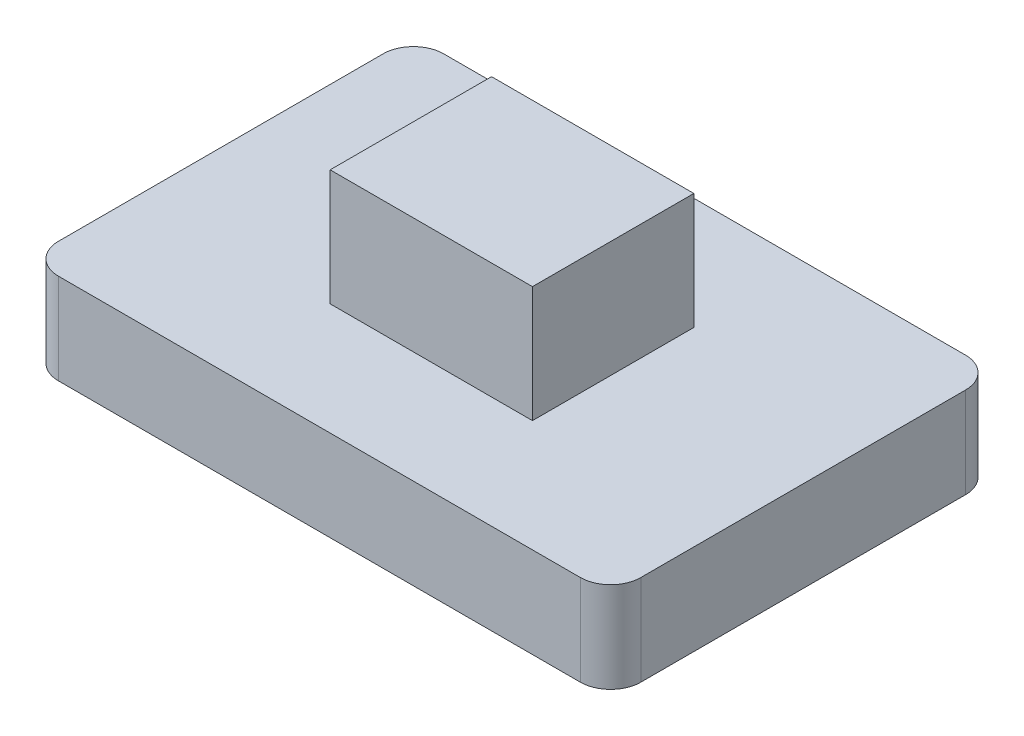
ISO-10303-21;
HEADER;
FILE_DESCRIPTION(('STEP AP214'),'2;1');
FILE_NAME('part.step','',(''),(''),'','','');
FILE_SCHEMA(('AUTOMOTIVE_DESIGN { 1 0 10303 214 1 1 1 1 }'));
ENDSEC;
DATA;
#1=APPLICATION_CONTEXT('core data for automotive mechanical design processes');
#2=APPLICATION_PROTOCOL_DEFINITION('international standard','automotive_design',2000,#1);
#3=PRODUCT_CONTEXT('',#1,'mechanical');
#4=PRODUCT('Part','Part','',(#3));
#5=PRODUCT_RELATED_PRODUCT_CATEGORY('part','',(#4));
#6=PRODUCT_DEFINITION_FORMATION('','',#4);
#7=PRODUCT_DEFINITION_CONTEXT('part definition',#1,'design');
#8=PRODUCT_DEFINITION('design','',#6,#7);
#9=PRODUCT_DEFINITION_SHAPE('','',#8);
#10=(LENGTH_UNIT() NAMED_UNIT(*) SI_UNIT(.MILLI.,.METRE.));
#11=(NAMED_UNIT(*) PLANE_ANGLE_UNIT() SI_UNIT($,.RADIAN.));
#12=(NAMED_UNIT(*) SI_UNIT($,.STERADIAN.) SOLID_ANGLE_UNIT());
#13=UNCERTAINTY_MEASURE_WITH_UNIT(LENGTH_MEASURE(1.E-05),#10,'distance_accuracy_value','');
#14=(GEOMETRIC_REPRESENTATION_CONTEXT(3) GLOBAL_UNCERTAINTY_ASSIGNED_CONTEXT((#13)) GLOBAL_UNIT_ASSIGNED_CONTEXT((#10,
#11,#12)) REPRESENTATION_CONTEXT('',''));
#15=CARTESIAN_POINT('',(0.,0.,0.));
#16=DIRECTION('',(0.,0.,1.));
#17=DIRECTION('',(1.,0.,0.));
#18=AXIS2_PLACEMENT_3D('',#15,#16,#17);
#19=CARTESIAN_POINT('',(6.35,0.,-6.35));
#20=DIRECTION('',(0.,-1.,0.));
#21=DIRECTION('',(0.,0.,-1.));
#22=AXIS2_PLACEMENT_3D('',#19,#20,#21);
#23=PLANE('',#22);
#24=CARTESIAN_POINT('',(6.35,0.,-6.35));
#25=DIRECTION('',(0.,1.,0.));
#26=DIRECTION('',(0.,0.,-1.));
#27=AXIS2_PLACEMENT_3D('',#24,#25,#26);
#28=CIRCLE('',#27,6.35);
#29=CARTESIAN_POINT('',(0.,0.,-6.35000000000004));
#30=VERTEX_POINT('',#29);
#31=CARTESIAN_POINT('',(6.35000000000004,0.,0.));
#32=VERTEX_POINT('',#31);
#33=EDGE_CURVE('E142',#30,#32,#28,.T.);
#34=ORIENTED_EDGE('',*,*,#33,.T.);
#35=DIRECTION('',(1.,0.,0.));
#36=VECTOR('',#35,1.);
#37=CARTESIAN_POINT('',(6.35000000000004,0.,0.));
#38=LINE('',#37,#36);
#39=CARTESIAN_POINT('',(116.00392100101,0.,0.));
#40=VERTEX_POINT('',#39);
#41=EDGE_CURVE('E145',#32,#40,#38,.T.);
#42=ORIENTED_EDGE('',*,*,#41,.T.);
#43=CARTESIAN_POINT('',(116.00392100101,0.,-6.35));
#44=DIRECTION('',(0.,1.,0.));
#45=DIRECTION('',(0.,0.,-1.));
#46=AXIS2_PLACEMENT_3D('',#43,#44,#45);
#47=CIRCLE('',#46,6.35);
#48=CARTESIAN_POINT('',(122.35392100101,0.,-6.35000000000004));
#49=VERTEX_POINT('',#48);
#50=EDGE_CURVE('E178',#40,#49,#47,.T.);
#51=ORIENTED_EDGE('',*,*,#50,.T.);
#52=DIRECTION('',(0.,0.,-1.));
#53=VECTOR('',#52,1.);
#54=CARTESIAN_POINT('',(122.35392100101,0.,-6.35000000000004));
#55=LINE('',#54,#53);
#56=CARTESIAN_POINT('',(122.35392100101,0.,-74.5792583117359));
#57=VERTEX_POINT('',#56);
#58=EDGE_CURVE('E181',#49,#57,#55,.T.);
#59=ORIENTED_EDGE('',*,*,#58,.T.);
#60=CARTESIAN_POINT('',(116.00392100101,0.,-74.579258311736));
#61=DIRECTION('',(0.,1.,0.));
#62=DIRECTION('',(0.,0.,1.));
#63=AXIS2_PLACEMENT_3D('',#60,#61,#62);
#64=CIRCLE('',#63,6.34999999999999);
#65=CARTESIAN_POINT('',(116.00392100101,0.,-80.9292583117359));
#66=VERTEX_POINT('',#65);
#67=EDGE_CURVE('E184',#57,#66,#64,.T.);
#68=ORIENTED_EDGE('',*,*,#67,.T.);
#69=DIRECTION('',(-1.,0.,0.));
#70=VECTOR('',#69,1.);
#71=CARTESIAN_POINT('',(6.35000000000004,0.,-80.9292583117359));
#72=LINE('',#71,#70);
#73=CARTESIAN_POINT('',(6.35000000000004,0.,-80.9292583117359));
#74=VERTEX_POINT('',#73);
#75=EDGE_CURVE('E187',#66,#74,#72,.T.);
#76=ORIENTED_EDGE('',*,*,#75,.T.);
#77=CARTESIAN_POINT('',(6.35,0.,-74.579258311736));
#78=DIRECTION('',(0.,1.,0.));
#79=DIRECTION('',(0.,0.,1.));
#80=AXIS2_PLACEMENT_3D('',#77,#78,#79);
#81=CIRCLE('',#80,6.35);
#82=CARTESIAN_POINT('',(0.,0.,-74.5792583117359));
#83=VERTEX_POINT('',#82);
#84=EDGE_CURVE('E190',#74,#83,#81,.T.);
#85=ORIENTED_EDGE('',*,*,#84,.T.);
#86=DIRECTION('',(0.,0.,1.));
#87=VECTOR('',#86,1.);
#88=CARTESIAN_POINT('',(0.,0.,-6.35000000000004));
#89=LINE('',#88,#87);
#90=EDGE_CURVE('E155',#83,#30,#89,.T.);
#91=ORIENTED_EDGE('',*,*,#90,.T.);
#92=EDGE_LOOP('',(#34,#42,#51,#59,#68,#76,#85,#91));
#93=FACE_BOUND('',#92,.T.);
#94=DIRECTION('',(0.,0.,-1.));
#95=VECTOR('',#94,1.);
#96=CARTESIAN_POINT('',(82.4295273333746,0.,-57.4189167731253));
#97=LINE('',#96,#95);
#98=CARTESIAN_POINT('',(82.4295273333746,0.,-23.5103415386106));
#99=VERTEX_POINT('',#98);
#100=CARTESIAN_POINT('',(82.4295273333746,0.,-57.4189167731253));
#101=VERTEX_POINT('',#100);
#102=EDGE_CURVE('E141',#99,#101,#97,.T.);
#103=ORIENTED_EDGE('',*,*,#102,.F.);
#104=DIRECTION('',(1.,0.,0.));
#105=VECTOR('',#104,1.);
#106=CARTESIAN_POINT('',(39.9243936676357,0.,-23.5103415386106));
#107=LINE('',#106,#105);
#108=CARTESIAN_POINT('',(39.9243936676357,0.,-23.5103415386106));
#109=VERTEX_POINT('',#108);
#110=EDGE_CURVE('E138',#109,#99,#107,.T.);
#111=ORIENTED_EDGE('',*,*,#110,.F.);
#112=DIRECTION('',(0.,0.,1.));
#113=VECTOR('',#112,1.);
#114=CARTESIAN_POINT('',(39.9243936676357,0.,-57.4189167731253));
#115=LINE('',#114,#113);
#116=CARTESIAN_POINT('',(39.9243936676357,0.,-57.4189167731253));
#117=VERTEX_POINT('',#116);
#118=EDGE_CURVE('E53',#117,#109,#115,.T.);
#119=ORIENTED_EDGE('',*,*,#118,.F.);
#120=DIRECTION('',(-1.,0.,0.));
#121=VECTOR('',#120,1.);
#122=CARTESIAN_POINT('',(39.9243936676357,0.,-57.4189167731253));
#123=LINE('',#122,#121);
#124=EDGE_CURVE('E48',#101,#117,#123,.T.);
#125=ORIENTED_EDGE('',*,*,#124,.F.);
#126=EDGE_LOOP('',(#103,#111,#119,#125));
#127=FACE_BOUND('',#126,.T.);
#128=ADVANCED_FACE('F31',(#93,#127),#23,.F.);
#129=CARTESIAN_POINT('',(6.35,-19.05,-6.35));
#130=DIRECTION('',(0.,1.,0.));
#131=DIRECTION('',(0.,0.,1.));
#132=AXIS2_PLACEMENT_3D('',#129,#130,#131);
#133=CYLINDRICAL_SURFACE('',#132,6.35);
#134=ORIENTED_EDGE('',*,*,#33,.F.);
#135=DIRECTION('',(0.,1.,0.));
#136=VECTOR('',#135,1.);
#137=CARTESIAN_POINT('',(0.,-19.05,-6.35000000000004));
#138=LINE('',#137,#136);
#139=CARTESIAN_POINT('',(0.,-19.05,-6.35000000000004));
#140=VERTEX_POINT('',#139);
#141=EDGE_CURVE('E11',#140,#30,#138,.T.);
#142=ORIENTED_EDGE('',*,*,#141,.F.);
#143=CARTESIAN_POINT('',(6.35,-19.05,-6.35));
#144=DIRECTION('',(0.,1.,0.));
#145=DIRECTION('',(0.,0.,-1.));
#146=AXIS2_PLACEMENT_3D('',#143,#144,#145);
#147=CIRCLE('',#146,6.35);
#148=CARTESIAN_POINT('',(6.35000000000004,-19.05,0.));
#149=VERTEX_POINT('',#148);
#150=EDGE_CURVE('E151',#140,#149,#147,.T.);
#151=ORIENTED_EDGE('',*,*,#150,.T.);
#152=DIRECTION('',(0.,1.,0.));
#153=VECTOR('',#152,1.);
#154=CARTESIAN_POINT('',(6.35000000000004,-19.05,0.));
#155=LINE('',#154,#153);
#156=EDGE_CURVE('E35',#149,#32,#155,.T.);
#157=ORIENTED_EDGE('',*,*,#156,.T.);
#158=EDGE_LOOP('',(#134,#142,#151,#157));
#159=FACE_BOUND('',#158,.T.);
#160=ADVANCED_FACE('F33',(#159),#133,.T.);
#161=CARTESIAN_POINT('',(0.,-19.05,-6.35000000000004));
#162=DIRECTION('',(-1.,0.,0.));
#163=DIRECTION('',(0.,0.,1.));
#164=AXIS2_PLACEMENT_3D('',#161,#162,#163);
#165=PLANE('',#164);
#166=ORIENTED_EDGE('',*,*,#90,.F.);
#167=DIRECTION('',(0.,1.,0.));
#168=VECTOR('',#167,1.);
#169=CARTESIAN_POINT('',(0.,-19.05,-74.5792583117359));
#170=LINE('',#169,#168);
#171=CARTESIAN_POINT('',(0.,-19.05,-74.5792583117359));
#172=VERTEX_POINT('',#171);
#173=EDGE_CURVE('E40',#172,#83,#170,.T.);
#174=ORIENTED_EDGE('',*,*,#173,.F.);
#175=DIRECTION('',(0.,0.,1.));
#176=VECTOR('',#175,1.);
#177=CARTESIAN_POINT('',(0.,-19.05,-6.35000000000004));
#178=LINE('',#177,#176);
#179=EDGE_CURVE('E173',#172,#140,#178,.T.);
#180=ORIENTED_EDGE('',*,*,#179,.T.);
#181=ORIENTED_EDGE('',*,*,#141,.T.);
#182=EDGE_LOOP('',(#166,#174,#180,#181));
#183=FACE_BOUND('',#182,.T.);
#184=ADVANCED_FACE('F216',(#183),#165,.T.);
#185=CARTESIAN_POINT('',(6.35,-19.05,-74.579258311736));
#186=DIRECTION('',(0.,1.,0.));
#187=DIRECTION('',(0.,0.,1.));
#188=AXIS2_PLACEMENT_3D('',#185,#186,#187);
#189=CYLINDRICAL_SURFACE('',#188,6.35);
#190=ORIENTED_EDGE('',*,*,#84,.F.);
#191=DIRECTION('',(0.,1.,0.));
#192=VECTOR('',#191,1.);
#193=CARTESIAN_POINT('',(6.35000000000004,-19.05,-80.9292583117359));
#194=LINE('',#193,#192);
#195=CARTESIAN_POINT('',(6.35000000000004,-19.05,-80.9292583117359));
#196=VERTEX_POINT('',#195);
#197=EDGE_CURVE('E196',#196,#74,#194,.T.);
#198=ORIENTED_EDGE('',*,*,#197,.F.);
#199=CARTESIAN_POINT('',(6.35,-19.05,-74.579258311736));
#200=DIRECTION('',(0.,1.,0.));
#201=DIRECTION('',(0.,0.,1.));
#202=AXIS2_PLACEMENT_3D('',#199,#200,#201);
#203=CIRCLE('',#202,6.35);
#204=EDGE_CURVE('E170',#196,#172,#203,.T.);
#205=ORIENTED_EDGE('',*,*,#204,.T.);
#206=ORIENTED_EDGE('',*,*,#173,.T.);
#207=EDGE_LOOP('',(#190,#198,#205,#206));
#208=FACE_BOUND('',#207,.T.);
#209=ADVANCED_FACE('F237',(#208),#189,.T.);
#210=CARTESIAN_POINT('',(6.35000000000004,-19.05,-80.9292583117359));
#211=DIRECTION('',(0.,0.,-1.));
#212=DIRECTION('',(-1.,0.,0.));
#213=AXIS2_PLACEMENT_3D('',#210,#211,#212);
#214=PLANE('',#213);
#215=ORIENTED_EDGE('',*,*,#75,.F.);
#216=DIRECTION('',(0.,1.,0.));
#217=VECTOR('',#216,1.);
#218=CARTESIAN_POINT('',(116.00392100101,-19.05,-80.9292583117359));
#219=LINE('',#218,#217);
#220=CARTESIAN_POINT('',(116.00392100101,-19.05,-80.9292583117359));
#221=VERTEX_POINT('',#220);
#222=EDGE_CURVE('E198',#221,#66,#219,.T.);
#223=ORIENTED_EDGE('',*,*,#222,.F.);
#224=DIRECTION('',(-1.,0.,0.));
#225=VECTOR('',#224,1.);
#226=CARTESIAN_POINT('',(6.35000000000004,-19.05,-80.9292583117359));
#227=LINE('',#226,#225);
#228=EDGE_CURVE('E167',#221,#196,#227,.T.);
#229=ORIENTED_EDGE('',*,*,#228,.T.);
#230=ORIENTED_EDGE('',*,*,#197,.T.);
#231=EDGE_LOOP('',(#215,#223,#229,#230));
#232=FACE_BOUND('',#231,.T.);
#233=ADVANCED_FACE('F235',(#232),#214,.T.);
#234=CARTESIAN_POINT('',(116.00392100101,-19.05,-74.579258311736));
#235=DIRECTION('',(0.,1.,0.));
#236=DIRECTION('',(0.,0.,1.));
#237=AXIS2_PLACEMENT_3D('',#234,#235,#236);
#238=CYLINDRICAL_SURFACE('',#237,6.34999999999999);
#239=ORIENTED_EDGE('',*,*,#67,.F.);
#240=DIRECTION('',(0.,1.,0.));
#241=VECTOR('',#240,1.);
#242=CARTESIAN_POINT('',(122.35392100101,-19.05,-74.5792583117359));
#243=LINE('',#242,#241);
#244=CARTESIAN_POINT('',(122.35392100101,-19.05,-74.5792583117359));
#245=VERTEX_POINT('',#244);
#246=EDGE_CURVE('E200',#245,#57,#243,.T.);
#247=ORIENTED_EDGE('',*,*,#246,.F.);
#248=CARTESIAN_POINT('',(116.00392100101,-19.05,-74.579258311736));
#249=DIRECTION('',(0.,1.,0.));
#250=DIRECTION('',(0.,0.,1.));
#251=AXIS2_PLACEMENT_3D('',#248,#249,#250);
#252=CIRCLE('',#251,6.34999999999999);
#253=EDGE_CURVE('E164',#245,#221,#252,.T.);
#254=ORIENTED_EDGE('',*,*,#253,.T.);
#255=ORIENTED_EDGE('',*,*,#222,.T.);
#256=EDGE_LOOP('',(#239,#247,#254,#255));
#257=FACE_BOUND('',#256,.T.);
#258=ADVANCED_FACE('F231',(#257),#238,.T.);
#259=CARTESIAN_POINT('',(122.35392100101,-19.05,-6.35000000000004));
#260=DIRECTION('',(1.,0.,0.));
#261=DIRECTION('',(0.,0.,-1.));
#262=AXIS2_PLACEMENT_3D('',#259,#260,#261);
#263=PLANE('',#262);
#264=ORIENTED_EDGE('',*,*,#58,.F.);
#265=DIRECTION('',(0.,1.,0.));
#266=VECTOR('',#265,1.);
#267=CARTESIAN_POINT('',(122.35392100101,-19.05,-6.35000000000004));
#268=LINE('',#267,#266);
#269=CARTESIAN_POINT('',(122.35392100101,-19.05,-6.35000000000004));
#270=VERTEX_POINT('',#269);
#271=EDGE_CURVE('E202',#270,#49,#268,.T.);
#272=ORIENTED_EDGE('',*,*,#271,.F.);
#273=DIRECTION('',(0.,0.,-1.));
#274=VECTOR('',#273,1.);
#275=CARTESIAN_POINT('',(122.35392100101,-19.05,-6.35000000000004));
#276=LINE('',#275,#274);
#277=EDGE_CURVE('E161',#270,#245,#276,.T.);
#278=ORIENTED_EDGE('',*,*,#277,.T.);
#279=ORIENTED_EDGE('',*,*,#246,.T.);
#280=EDGE_LOOP('',(#264,#272,#278,#279));
#281=FACE_BOUND('',#280,.T.);
#282=ADVANCED_FACE('F229',(#281),#263,.T.);
#283=CARTESIAN_POINT('',(116.00392100101,-19.05,-6.35));
#284=DIRECTION('',(0.,1.,0.));
#285=DIRECTION('',(0.,0.,1.));
#286=AXIS2_PLACEMENT_3D('',#283,#284,#285);
#287=CYLINDRICAL_SURFACE('',#286,6.35);
#288=ORIENTED_EDGE('',*,*,#50,.F.);
#289=DIRECTION('',(0.,1.,0.));
#290=VECTOR('',#289,1.);
#291=CARTESIAN_POINT('',(116.00392100101,-19.05,0.));
#292=LINE('',#291,#290);
#293=CARTESIAN_POINT('',(116.00392100101,-19.05,0.));
#294=VERTEX_POINT('',#293);
#295=EDGE_CURVE('E203',#294,#40,#292,.T.);
#296=ORIENTED_EDGE('',*,*,#295,.F.);
#297=CARTESIAN_POINT('',(116.00392100101,-19.05,-6.35));
#298=DIRECTION('',(0.,1.,0.));
#299=DIRECTION('',(0.,0.,-1.));
#300=AXIS2_PLACEMENT_3D('',#297,#298,#299);
#301=CIRCLE('',#300,6.35);
#302=EDGE_CURVE('E158',#294,#270,#301,.T.);
#303=ORIENTED_EDGE('',*,*,#302,.T.);
#304=ORIENTED_EDGE('',*,*,#271,.T.);
#305=EDGE_LOOP('',(#288,#296,#303,#304));
#306=FACE_BOUND('',#305,.T.);
#307=ADVANCED_FACE('F225',(#306),#287,.T.);
#308=CARTESIAN_POINT('',(6.35000000000004,-19.05,0.));
#309=DIRECTION('',(0.,0.,1.));
#310=DIRECTION('',(1.,0.,0.));
#311=AXIS2_PLACEMENT_3D('',#308,#309,#310);
#312=PLANE('',#311);
#313=ORIENTED_EDGE('',*,*,#41,.F.);
#314=ORIENTED_EDGE('',*,*,#156,.F.);
#315=DIRECTION('',(1.,0.,0.));
#316=VECTOR('',#315,1.);
#317=CARTESIAN_POINT('',(6.35000000000004,-19.05,0.));
#318=LINE('',#317,#316);
#319=EDGE_CURVE('E154',#149,#294,#318,.T.);
#320=ORIENTED_EDGE('',*,*,#319,.T.);
#321=ORIENTED_EDGE('',*,*,#295,.T.);
#322=EDGE_LOOP('',(#313,#314,#320,#321));
#323=FACE_BOUND('',#322,.T.);
#324=ADVANCED_FACE('F211',(#323),#312,.T.);
#325=CARTESIAN_POINT('',(6.35,-19.05,-6.35));
#326=DIRECTION('',(0.,-1.,0.));
#327=DIRECTION('',(0.,0.,-1.));
#328=AXIS2_PLACEMENT_3D('',#325,#326,#327);
#329=PLANE('',#328);
#330=ORIENTED_EDGE('',*,*,#150,.F.);
#331=ORIENTED_EDGE('',*,*,#179,.F.);
#332=ORIENTED_EDGE('',*,*,#204,.F.);
#333=ORIENTED_EDGE('',*,*,#228,.F.);
#334=ORIENTED_EDGE('',*,*,#253,.F.);
#335=ORIENTED_EDGE('',*,*,#277,.F.);
#336=ORIENTED_EDGE('',*,*,#302,.F.);
#337=ORIENTED_EDGE('',*,*,#319,.F.);
#338=EDGE_LOOP('',(#330,#331,#332,#333,#334,#335,#336,#337));
#339=FACE_BOUND('',#338,.T.);
#340=ADVANCED_FACE('F219',(#339),#329,.T.);
#341=CARTESIAN_POINT('',(82.4295273333746,24.384,-57.4189167731253));
#342=DIRECTION('',(-1.,0.,0.));
#343=DIRECTION('',(0.,0.,1.));
#344=AXIS2_PLACEMENT_3D('',#341,#342,#343);
#345=PLANE('',#344);
#346=ORIENTED_EDGE('',*,*,#102,.T.);
#347=DIRECTION('',(0.,-1.,0.));
#348=VECTOR('',#347,1.);
#349=CARTESIAN_POINT('',(82.4295273333746,24.384,-57.4189167731253));
#350=LINE('',#349,#348);
#351=CARTESIAN_POINT('',(82.4295273333746,24.384,-57.4189167731253));
#352=VERTEX_POINT('',#351);
#353=EDGE_CURVE('E122',#352,#101,#350,.T.);
#354=ORIENTED_EDGE('',*,*,#353,.F.);
#355=DIRECTION('',(0.,0.,-1.));
#356=VECTOR('',#355,1.);
#357=CARTESIAN_POINT('',(82.4295273333746,24.384,-57.4189167731253));
#358=LINE('',#357,#356);
#359=CARTESIAN_POINT('',(82.4295273333746,24.384,-23.5103415386106));
#360=VERTEX_POINT('',#359);
#361=EDGE_CURVE('E129',#360,#352,#358,.T.);
#362=ORIENTED_EDGE('',*,*,#361,.F.);
#363=DIRECTION('',(0.,-1.,0.));
#364=VECTOR('',#363,1.);
#365=CARTESIAN_POINT('',(82.4295273333746,24.384,-23.5103415386106));
#366=LINE('',#365,#364);
#367=EDGE_CURVE('E362',#360,#99,#366,.T.);
#368=ORIENTED_EDGE('',*,*,#367,.T.);
#369=EDGE_LOOP('',(#346,#354,#362,#368));
#370=FACE_BOUND('',#369,.T.);
#371=ADVANCED_FACE('F140',(#370),#345,.F.);
#372=CARTESIAN_POINT('',(39.9243936676357,24.384,-57.4189167731253));
#373=DIRECTION('',(0.,0.,1.));
#374=DIRECTION('',(1.,0.,0.));
#375=AXIS2_PLACEMENT_3D('',#372,#373,#374);
#376=PLANE('',#375);
#377=ORIENTED_EDGE('',*,*,#124,.T.);
#378=DIRECTION('',(0.,-1.,0.));
#379=VECTOR('',#378,1.);
#380=CARTESIAN_POINT('',(39.9243936676357,24.384,-57.4189167731253));
#381=LINE('',#380,#379);
#382=CARTESIAN_POINT('',(39.9243936676357,24.384,-57.4189167731253));
#383=VERTEX_POINT('',#382);
#384=EDGE_CURVE('E125',#383,#117,#381,.T.);
#385=ORIENTED_EDGE('',*,*,#384,.F.);
#386=DIRECTION('',(-1.,0.,0.));
#387=VECTOR('',#386,1.);
#388=CARTESIAN_POINT('',(39.9243936676357,24.384,-57.4189167731253));
#389=LINE('',#388,#387);
#390=EDGE_CURVE('E118',#352,#383,#389,.T.);
#391=ORIENTED_EDGE('',*,*,#390,.F.);
#392=ORIENTED_EDGE('',*,*,#353,.T.);
#393=EDGE_LOOP('',(#377,#385,#391,#392));
#394=FACE_BOUND('',#393,.T.);
#395=ADVANCED_FACE('F120',(#394),#376,.F.);
#396=CARTESIAN_POINT('',(39.9243936676357,24.384,-57.4189167731253));
#397=DIRECTION('',(1.,0.,0.));
#398=DIRECTION('',(0.,0.,-1.));
#399=AXIS2_PLACEMENT_3D('',#396,#397,#398);
#400=PLANE('',#399);
#401=ORIENTED_EDGE('',*,*,#118,.T.);
#402=DIRECTION('',(0.,-1.,0.));
#403=VECTOR('',#402,1.);
#404=CARTESIAN_POINT('',(39.9243936676357,24.384,-23.5103415386106));
#405=LINE('',#404,#403);
#406=CARTESIAN_POINT('',(39.9243936676357,24.384,-23.5103415386106));
#407=VERTEX_POINT('',#406);
#408=EDGE_CURVE('E147',#407,#109,#405,.T.);
#409=ORIENTED_EDGE('',*,*,#408,.F.);
#410=DIRECTION('',(0.,0.,1.));
#411=VECTOR('',#410,1.);
#412=CARTESIAN_POINT('',(39.9243936676357,24.384,-57.4189167731253));
#413=LINE('',#412,#411);
#414=EDGE_CURVE('E128',#383,#407,#413,.T.);
#415=ORIENTED_EDGE('',*,*,#414,.F.);
#416=ORIENTED_EDGE('',*,*,#384,.T.);
#417=EDGE_LOOP('',(#401,#409,#415,#416));
#418=FACE_BOUND('',#417,.T.);
#419=ADVANCED_FACE('F258',(#418),#400,.F.);
#420=CARTESIAN_POINT('',(39.9243936676357,24.384,-23.5103415386106));
#421=DIRECTION('',(0.,0.,-1.));
#422=DIRECTION('',(-1.,0.,0.));
#423=AXIS2_PLACEMENT_3D('',#420,#421,#422);
#424=PLANE('',#423);
#425=ORIENTED_EDGE('',*,*,#110,.T.);
#426=ORIENTED_EDGE('',*,*,#367,.F.);
#427=DIRECTION('',(1.,0.,0.));
#428=VECTOR('',#427,1.);
#429=CARTESIAN_POINT('',(39.9243936676357,24.384,-23.5103415386106));
#430=LINE('',#429,#428);
#431=EDGE_CURVE('E134',#407,#360,#430,.T.);
#432=ORIENTED_EDGE('',*,*,#431,.F.);
#433=ORIENTED_EDGE('',*,*,#408,.T.);
#434=EDGE_LOOP('',(#425,#426,#432,#433));
#435=FACE_BOUND('',#434,.T.);
#436=ADVANCED_FACE('F261',(#435),#424,.F.);
#437=CARTESIAN_POINT('',(82.4295273333746,24.384,-23.5103415386106));
#438=DIRECTION('',(0.,1.,0.));
#439=DIRECTION('',(0.,0.,1.));
#440=AXIS2_PLACEMENT_3D('',#437,#438,#439);
#441=PLANE('',#440);
#442=ORIENTED_EDGE('',*,*,#361,.T.);
#443=ORIENTED_EDGE('',*,*,#390,.T.);
#444=ORIENTED_EDGE('',*,*,#414,.T.);
#445=ORIENTED_EDGE('',*,*,#431,.T.);
#446=EDGE_LOOP('',(#442,#443,#444,#445));
#447=FACE_BOUND('',#446,.T.);
#448=ADVANCED_FACE('F132',(#447),#441,.T.);
#449=CLOSED_SHELL('',(#128,#160,#184,#209,#233,#258,#282,#307,#324,#340,#371,#395,#419,#436,#448));
#450=MANIFOLD_SOLID_BREP('B2',#449);
#451=ADVANCED_BREP_SHAPE_REPRESENTATION('',(#18,#450),#14);
#452=SHAPE_DEFINITION_REPRESENTATION(#9,#451);
ENDSEC;
END-ISO-10303-21;
